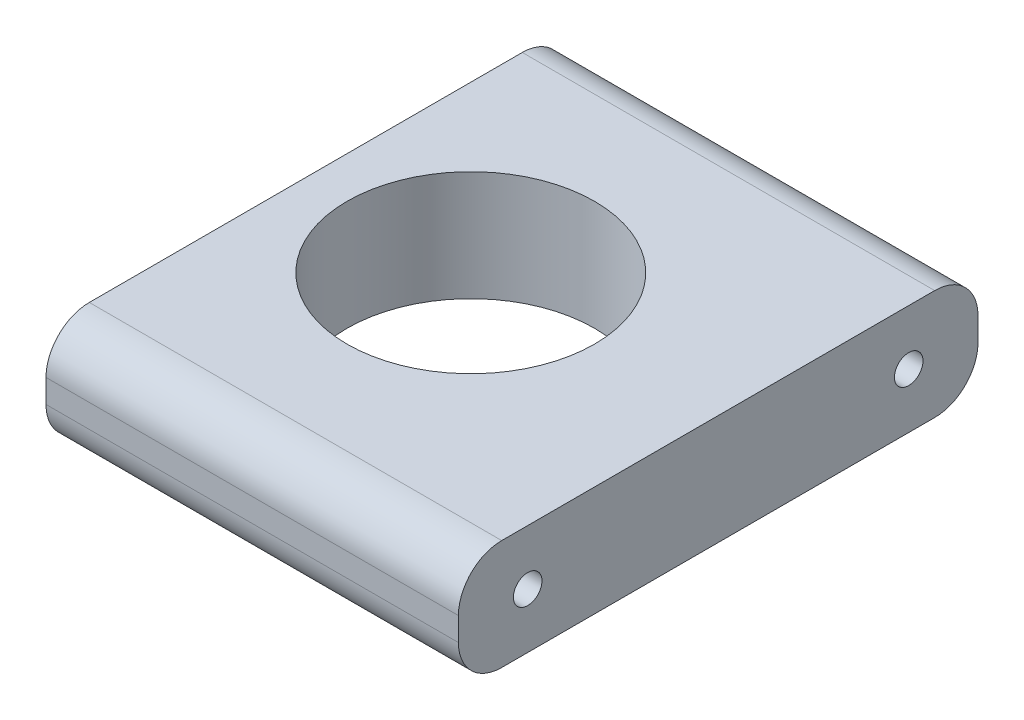
ISO-10303-21;
HEADER;
FILE_DESCRIPTION(('STEP AP214'),'2;1');
FILE_NAME('part.step','',(''),(''),'','','');
FILE_SCHEMA(('AUTOMOTIVE_DESIGN { 1 0 10303 214 1 1 1 1 }'));
ENDSEC;
DATA;
#1=APPLICATION_CONTEXT('core data for automotive mechanical design processes');
#2=APPLICATION_PROTOCOL_DEFINITION('international standard','automotive_design',2000,#1);
#3=PRODUCT_CONTEXT('',#1,'mechanical');
#4=PRODUCT('Part','Part','',(#3));
#5=PRODUCT_RELATED_PRODUCT_CATEGORY('part','',(#4));
#6=PRODUCT_DEFINITION_FORMATION('','',#4);
#7=PRODUCT_DEFINITION_CONTEXT('part definition',#1,'design');
#8=PRODUCT_DEFINITION('design','',#6,#7);
#9=PRODUCT_DEFINITION_SHAPE('','',#8);
#10=(LENGTH_UNIT() NAMED_UNIT(*) SI_UNIT(.MILLI.,.METRE.));
#11=(NAMED_UNIT(*) PLANE_ANGLE_UNIT() SI_UNIT($,.RADIAN.));
#12=(NAMED_UNIT(*) SI_UNIT($,.STERADIAN.) SOLID_ANGLE_UNIT());
#13=UNCERTAINTY_MEASURE_WITH_UNIT(LENGTH_MEASURE(1.E-05),#10,'distance_accuracy_value','');
#14=(GEOMETRIC_REPRESENTATION_CONTEXT(3) GLOBAL_UNCERTAINTY_ASSIGNED_CONTEXT((#13)) GLOBAL_UNIT_ASSIGNED_CONTEXT((#10,
#11,#12)) REPRESENTATION_CONTEXT('',''));
#15=CARTESIAN_POINT('',(0.,0.,0.));
#16=DIRECTION('',(0.,0.,1.));
#17=DIRECTION('',(1.,0.,0.));
#18=AXIS2_PLACEMENT_3D('',#15,#16,#17);
#19=CARTESIAN_POINT('',(-6.35250000000001,12.7,0.));
#20=DIRECTION('',(1.,0.,0.));
#21=DIRECTION('',(0.,0.,-1.));
#22=AXIS2_PLACEMENT_3D('',#19,#20,#21);
#23=PLANE('',#22);
#24=CARTESIAN_POINT('',(-6.3525,6.35,-19.8875));
#25=DIRECTION('',(1.,0.,0.));
#26=DIRECTION('',(0.,0.,-1.));
#27=AXIS2_PLACEMENT_3D('',#24,#25,#26);
#28=CIRCLE('',#27,1.64999999999999);
#29=CARTESIAN_POINT('',(-6.3525,6.35,-21.5375));
#30=VERTEX_POINT('',#29);
#31=EDGE_CURVE('E202',#30,#30,#28,.T.);
#32=ORIENTED_EDGE('',*,*,#31,.T.);
#33=EDGE_LOOP('',(#32));
#34=FACE_BOUND('',#33,.T.);
#35=CARTESIAN_POINT('',(-6.35250000000001,6.35,-63.8875));
#36=DIRECTION('',(1.,0.,0.));
#37=DIRECTION('',(0.,0.,-1.));
#38=AXIS2_PLACEMENT_3D('',#35,#36,#37);
#39=CIRCLE('',#38,1.64999999999999);
#40=CARTESIAN_POINT('',(-6.35250000000001,6.35,-65.5375));
#41=VERTEX_POINT('',#40);
#42=EDGE_CURVE('E189',#41,#41,#39,.T.);
#43=ORIENTED_EDGE('',*,*,#42,.T.);
#44=EDGE_LOOP('',(#43));
#45=FACE_BOUND('',#44,.T.);
#46=DIRECTION('',(0.,-1.,0.));
#47=VECTOR('',#46,1.);
#48=CARTESIAN_POINT('',(-6.3525,12.7,-11.8875));
#49=LINE('',#48,#47);
#50=CARTESIAN_POINT('',(-6.3525,7.7,-11.8875));
#51=VERTEX_POINT('',#50);
#52=CARTESIAN_POINT('',(-6.3525,5.,-11.8875));
#53=VERTEX_POINT('',#52);
#54=EDGE_CURVE('E134',#51,#53,#49,.T.);
#55=ORIENTED_EDGE('',*,*,#54,.F.);
#56=CARTESIAN_POINT('',(-6.35250000000001,7.7,-16.8875));
#57=DIRECTION('',(1.,0.,0.));
#58=DIRECTION('',(0.,0.,-1.));
#59=AXIS2_PLACEMENT_3D('',#56,#57,#58);
#60=CIRCLE('',#59,5.);
#61=CARTESIAN_POINT('',(-6.35250000000001,12.7,-16.8875));
#62=VERTEX_POINT('',#61);
#63=EDGE_CURVE('E138',#51,#62,#60,.F.);
#64=ORIENTED_EDGE('',*,*,#63,.T.);
#65=DIRECTION('',(0.,0.,1.));
#66=VECTOR('',#65,1.);
#67=CARTESIAN_POINT('',(-6.35250000000001,12.7,0.));
#68=LINE('',#67,#66);
#69=CARTESIAN_POINT('',(-6.3525,12.7,-66.8875));
#70=VERTEX_POINT('',#69);
#71=EDGE_CURVE('E188',#70,#62,#68,.T.);
#72=ORIENTED_EDGE('',*,*,#71,.F.);
#73=CARTESIAN_POINT('',(-6.3525,7.7,-66.8875));
#74=DIRECTION('',(1.,0.,0.));
#75=DIRECTION('',(0.,0.,-1.));
#76=AXIS2_PLACEMENT_3D('',#73,#74,#75);
#77=CIRCLE('',#76,5.);
#78=CARTESIAN_POINT('',(-6.3525,7.7,-71.8875));
#79=VERTEX_POINT('',#78);
#80=EDGE_CURVE('E139',#70,#79,#77,.F.);
#81=ORIENTED_EDGE('',*,*,#80,.T.);
#82=DIRECTION('',(0.,-1.,0.));
#83=VECTOR('',#82,1.);
#84=CARTESIAN_POINT('',(-6.3525,12.7,-71.8875));
#85=LINE('',#84,#83);
#86=CARTESIAN_POINT('',(-6.3525,5.,-71.8875));
#87=VERTEX_POINT('',#86);
#88=EDGE_CURVE('E166',#79,#87,#85,.T.);
#89=ORIENTED_EDGE('',*,*,#88,.T.);
#90=CARTESIAN_POINT('',(-6.3525,5.,-66.8875));
#91=DIRECTION('',(1.,0.,0.));
#92=DIRECTION('',(0.,0.,-1.));
#93=AXIS2_PLACEMENT_3D('',#90,#91,#92);
#94=CIRCLE('',#93,5.);
#95=CARTESIAN_POINT('',(-6.3525,0.,-66.8875));
#96=VERTEX_POINT('',#95);
#97=EDGE_CURVE('E141',#87,#96,#94,.F.);
#98=ORIENTED_EDGE('',*,*,#97,.T.);
#99=DIRECTION('',(0.,0.,1.));
#100=VECTOR('',#99,1.);
#101=CARTESIAN_POINT('',(-6.35250000000001,0.,0.));
#102=LINE('',#101,#100);
#103=CARTESIAN_POINT('',(-6.35250000000001,0.,-16.8875));
#104=VERTEX_POINT('',#103);
#105=EDGE_CURVE('E185',#96,#104,#102,.T.);
#106=ORIENTED_EDGE('',*,*,#105,.T.);
#107=CARTESIAN_POINT('',(-6.35250000000001,5.,-16.8875));
#108=DIRECTION('',(1.,0.,0.));
#109=DIRECTION('',(0.,0.,-1.));
#110=AXIS2_PLACEMENT_3D('',#107,#108,#109);
#111=CIRCLE('',#110,5.);
#112=EDGE_CURVE('E147',#104,#53,#111,.F.);
#113=ORIENTED_EDGE('',*,*,#112,.T.);
#114=EDGE_LOOP('',(#55,#64,#72,#81,#89,#98,#106,#113));
#115=FACE_BOUND('',#114,.T.);
#116=ADVANCED_FACE('F47',(#34,#45,#115),#23,.F.);
#117=CARTESIAN_POINT('',(0.,12.7,-11.8875));
#118=DIRECTION('',(0.,0.,1.));
#119=DIRECTION('',(1.,0.,0.));
#120=AXIS2_PLACEMENT_3D('',#117,#118,#119);
#121=PLANE('',#120);
#122=DIRECTION('',(0.,-1.,0.));
#123=VECTOR('',#122,1.);
#124=CARTESIAN_POINT('',(41.2725,12.7,-11.8875));
#125=LINE('',#124,#123);
#126=CARTESIAN_POINT('',(41.2725,7.7,-11.8875));
#127=VERTEX_POINT('',#126);
#128=CARTESIAN_POINT('',(41.2725,5.,-11.8875));
#129=VERTEX_POINT('',#128);
#130=EDGE_CURVE('E116',#127,#129,#125,.T.);
#131=ORIENTED_EDGE('',*,*,#130,.F.);
#132=DIRECTION('',(-1.,0.,0.));
#133=VECTOR('',#132,1.);
#134=CARTESIAN_POINT('',(0.,7.7,-11.8875));
#135=LINE('',#134,#133);
#136=EDGE_CURVE('E130',#127,#51,#135,.T.);
#137=ORIENTED_EDGE('',*,*,#136,.T.);
#138=ORIENTED_EDGE('',*,*,#54,.T.);
#139=DIRECTION('',(-1.,0.,0.));
#140=VECTOR('',#139,1.);
#141=CARTESIAN_POINT('',(41.2725,5.,-11.8875));
#142=LINE('',#141,#140);
#143=EDGE_CURVE('E133',#53,#129,#142,.F.);
#144=ORIENTED_EDGE('',*,*,#143,.T.);
#145=EDGE_LOOP('',(#131,#137,#138,#144));
#146=FACE_BOUND('',#145,.T.);
#147=ADVANCED_FACE('F128',(#146),#121,.T.);
#148=CARTESIAN_POINT('',(41.2725,12.7,0.));
#149=DIRECTION('',(1.,0.,0.));
#150=DIRECTION('',(0.,0.,-1.));
#151=AXIS2_PLACEMENT_3D('',#148,#149,#150);
#152=PLANE('',#151);
#153=CARTESIAN_POINT('',(41.2725,6.35,-19.8875));
#154=DIRECTION('',(1.,0.,0.));
#155=DIRECTION('',(0.,0.,-1.));
#156=AXIS2_PLACEMENT_3D('',#153,#154,#155);
#157=CIRCLE('',#156,1.64999999999999);
#158=CARTESIAN_POINT('',(41.2725,6.35,-21.5375));
#159=VERTEX_POINT('',#158);
#160=EDGE_CURVE('E205',#159,#159,#157,.T.);
#161=ORIENTED_EDGE('',*,*,#160,.F.);
#162=EDGE_LOOP('',(#161));
#163=FACE_BOUND('',#162,.T.);
#164=CARTESIAN_POINT('',(41.2725,6.35,-63.8875));
#165=DIRECTION('',(1.,0.,0.));
#166=DIRECTION('',(0.,0.,-1.));
#167=AXIS2_PLACEMENT_3D('',#164,#165,#166);
#168=CIRCLE('',#167,1.64999999999999);
#169=CARTESIAN_POINT('',(41.2725,6.35,-65.5375));
#170=VERTEX_POINT('',#169);
#171=EDGE_CURVE('E199',#170,#170,#168,.T.);
#172=ORIENTED_EDGE('',*,*,#171,.F.);
#173=EDGE_LOOP('',(#172));
#174=FACE_BOUND('',#173,.T.);
#175=DIRECTION('',(0.,0.,1.));
#176=VECTOR('',#175,1.);
#177=CARTESIAN_POINT('',(41.2725,12.7,0.));
#178=LINE('',#177,#176);
#179=CARTESIAN_POINT('',(41.2725,12.7,-66.8875));
#180=VERTEX_POINT('',#179);
#181=CARTESIAN_POINT('',(41.2725,12.7,-16.8875));
#182=VERTEX_POINT('',#181);
#183=EDGE_CURVE('E119',#180,#182,#178,.T.);
#184=ORIENTED_EDGE('',*,*,#183,.T.);
#185=CARTESIAN_POINT('',(41.2725,7.7,-16.8875));
#186=DIRECTION('',(1.,0.,0.));
#187=DIRECTION('',(0.,0.,-1.));
#188=AXIS2_PLACEMENT_3D('',#185,#186,#187);
#189=CIRCLE('',#188,5.);
#190=EDGE_CURVE('E113',#182,#127,#189,.T.);
#191=ORIENTED_EDGE('',*,*,#190,.T.);
#192=ORIENTED_EDGE('',*,*,#130,.T.);
#193=CARTESIAN_POINT('',(41.2725,5.,-16.8875));
#194=DIRECTION('',(1.,0.,0.));
#195=DIRECTION('',(0.,0.,-1.));
#196=AXIS2_PLACEMENT_3D('',#193,#194,#195);
#197=CIRCLE('',#196,5.);
#198=CARTESIAN_POINT('',(41.2725,0.,-16.8875));
#199=VERTEX_POINT('',#198);
#200=EDGE_CURVE('E124',#129,#199,#197,.T.);
#201=ORIENTED_EDGE('',*,*,#200,.T.);
#202=DIRECTION('',(0.,0.,1.));
#203=VECTOR('',#202,1.);
#204=CARTESIAN_POINT('',(41.2725,0.,0.));
#205=LINE('',#204,#203);
#206=CARTESIAN_POINT('',(41.2725,0.,-66.8875));
#207=VERTEX_POINT('',#206);
#208=EDGE_CURVE('E177',#207,#199,#205,.T.);
#209=ORIENTED_EDGE('',*,*,#208,.F.);
#210=CARTESIAN_POINT('',(41.2725,5.,-66.8875));
#211=DIRECTION('',(1.,0.,0.));
#212=DIRECTION('',(0.,0.,-1.));
#213=AXIS2_PLACEMENT_3D('',#210,#211,#212);
#214=CIRCLE('',#213,5.);
#215=CARTESIAN_POINT('',(41.2725,5.,-71.8875));
#216=VERTEX_POINT('',#215);
#217=EDGE_CURVE('E62',#207,#216,#214,.T.);
#218=ORIENTED_EDGE('',*,*,#217,.T.);
#219=DIRECTION('',(0.,-1.,0.));
#220=VECTOR('',#219,1.);
#221=CARTESIAN_POINT('',(41.2725,12.7,-71.8875));
#222=LINE('',#221,#220);
#223=CARTESIAN_POINT('',(41.2725,7.7,-71.8875));
#224=VERTEX_POINT('',#223);
#225=EDGE_CURVE('E135',#224,#216,#222,.T.);
#226=ORIENTED_EDGE('',*,*,#225,.F.);
#227=CARTESIAN_POINT('',(41.2725,7.7,-66.8875));
#228=DIRECTION('',(1.,0.,0.));
#229=DIRECTION('',(0.,0.,-1.));
#230=AXIS2_PLACEMENT_3D('',#227,#228,#229);
#231=CIRCLE('',#230,5.);
#232=EDGE_CURVE('E70',#224,#180,#231,.T.);
#233=ORIENTED_EDGE('',*,*,#232,.T.);
#234=EDGE_LOOP('',(#184,#191,#192,#201,#209,#218,#226,#233));
#235=FACE_BOUND('',#234,.T.);
#236=ADVANCED_FACE('F115',(#163,#174,#235),#152,.T.);
#237=CARTESIAN_POINT('',(0.,12.7,-71.8875));
#238=DIRECTION('',(0.,0.,-1.));
#239=DIRECTION('',(-1.,0.,0.));
#240=AXIS2_PLACEMENT_3D('',#237,#238,#239);
#241=PLANE('',#240);
#242=ORIENTED_EDGE('',*,*,#225,.T.);
#243=DIRECTION('',(1.,0.,0.));
#244=VECTOR('',#243,1.);
#245=CARTESIAN_POINT('',(-6.3525,5.,-71.8875));
#246=LINE('',#245,#244);
#247=EDGE_CURVE('E11',#216,#87,#246,.F.);
#248=ORIENTED_EDGE('',*,*,#247,.T.);
#249=ORIENTED_EDGE('',*,*,#88,.F.);
#250=DIRECTION('',(1.,0.,0.));
#251=VECTOR('',#250,1.);
#252=CARTESIAN_POINT('',(0.,7.7,-71.8875));
#253=LINE('',#252,#251);
#254=EDGE_CURVE('E55',#79,#224,#253,.T.);
#255=ORIENTED_EDGE('',*,*,#254,.T.);
#256=EDGE_LOOP('',(#242,#248,#249,#255));
#257=FACE_BOUND('',#256,.T.);
#258=ADVANCED_FACE('F163',(#257),#241,.T.);
#259=CARTESIAN_POINT('',(12.7,12.7,-41.8875));
#260=DIRECTION('',(0.,-1.,0.));
#261=DIRECTION('',(0.,0.,-1.));
#262=AXIS2_PLACEMENT_3D('',#259,#260,#261);
#263=CYLINDRICAL_SURFACE('',#262,14.2875);
#264=CARTESIAN_POINT('',(12.7,12.7,-41.8875));
#265=DIRECTION('',(0.,1.,0.));
#266=DIRECTION('',(0.,0.,1.));
#267=AXIS2_PLACEMENT_3D('',#264,#265,#266);
#268=CIRCLE('',#267,14.2875);
#269=CARTESIAN_POINT('',(12.7,12.7,-27.6));
#270=VERTEX_POINT('',#269);
#271=EDGE_CURVE('E169',#270,#270,#268,.T.);
#272=ORIENTED_EDGE('',*,*,#271,.T.);
#273=EDGE_LOOP('',(#272));
#274=FACE_BOUND('',#273,.T.);
#275=CARTESIAN_POINT('',(12.7,0.,-41.8875));
#276=DIRECTION('',(0.,1.,0.));
#277=DIRECTION('',(0.,0.,1.));
#278=AXIS2_PLACEMENT_3D('',#275,#276,#277);
#279=CIRCLE('',#278,14.2875);
#280=CARTESIAN_POINT('',(12.7,0.,-27.6));
#281=VERTEX_POINT('',#280);
#282=EDGE_CURVE('E184',#281,#281,#279,.T.);
#283=ORIENTED_EDGE('',*,*,#282,.F.);
#284=EDGE_LOOP('',(#283));
#285=FACE_BOUND('',#284,.T.);
#286=ADVANCED_FACE('F255',(#274,#285),#263,.F.);
#287=CARTESIAN_POINT('',(0.,12.7,0.));
#288=DIRECTION('',(0.,1.,0.));
#289=DIRECTION('',(0.,0.,1.));
#290=AXIS2_PLACEMENT_3D('',#287,#288,#289);
#291=PLANE('',#290);
#292=ORIENTED_EDGE('',*,*,#71,.T.);
#293=DIRECTION('',(-1.,0.,0.));
#294=VECTOR('',#293,1.);
#295=CARTESIAN_POINT('',(0.,12.7,-16.8875));
#296=LINE('',#295,#294);
#297=EDGE_CURVE('E152',#62,#182,#296,.F.);
#298=ORIENTED_EDGE('',*,*,#297,.T.);
#299=ORIENTED_EDGE('',*,*,#183,.F.);
#300=DIRECTION('',(1.,0.,0.));
#301=VECTOR('',#300,1.);
#302=CARTESIAN_POINT('',(0.,12.7,-66.8875));
#303=LINE('',#302,#301);
#304=EDGE_CURVE('E150',#180,#70,#303,.F.);
#305=ORIENTED_EDGE('',*,*,#304,.T.);
#306=EDGE_LOOP('',(#292,#298,#299,#305));
#307=FACE_BOUND('',#306,.T.);
#308=ORIENTED_EDGE('',*,*,#271,.F.);
#309=EDGE_LOOP('',(#308));
#310=FACE_BOUND('',#309,.T.);
#311=ADVANCED_FACE('F227',(#307,#310),#291,.T.);
#312=CARTESIAN_POINT('',(0.,0.,0.));
#313=DIRECTION('',(0.,1.,0.));
#314=DIRECTION('',(0.,0.,1.));
#315=AXIS2_PLACEMENT_3D('',#312,#313,#314);
#316=PLANE('',#315);
#317=ORIENTED_EDGE('',*,*,#208,.T.);
#318=DIRECTION('',(-1.,0.,0.));
#319=VECTOR('',#318,1.);
#320=CARTESIAN_POINT('',(-6.3525,0.,-16.8875));
#321=LINE('',#320,#319);
#322=EDGE_CURVE('E159',#199,#104,#321,.T.);
#323=ORIENTED_EDGE('',*,*,#322,.T.);
#324=ORIENTED_EDGE('',*,*,#105,.F.);
#325=DIRECTION('',(1.,0.,0.));
#326=VECTOR('',#325,1.);
#327=CARTESIAN_POINT('',(41.2725,0.,-66.8875));
#328=LINE('',#327,#326);
#329=EDGE_CURVE('E123',#96,#207,#328,.T.);
#330=ORIENTED_EDGE('',*,*,#329,.T.);
#331=EDGE_LOOP('',(#317,#323,#324,#330));
#332=FACE_BOUND('',#331,.T.);
#333=ORIENTED_EDGE('',*,*,#282,.T.);
#334=EDGE_LOOP('',(#333));
#335=FACE_BOUND('',#334,.T.);
#336=ADVANCED_FACE('F179',(#332,#335),#316,.F.);
#337=CARTESIAN_POINT('',(41.2725,6.35,-63.8875));
#338=DIRECTION('',(1.,0.,0.));
#339=DIRECTION('',(0.,0.,-1.));
#340=AXIS2_PLACEMENT_3D('',#337,#338,#339);
#341=CYLINDRICAL_SURFACE('',#340,1.64999999999999);
#342=ORIENTED_EDGE('',*,*,#42,.F.);
#343=EDGE_LOOP('',(#342));
#344=FACE_BOUND('',#343,.T.);
#345=ORIENTED_EDGE('',*,*,#171,.T.);
#346=EDGE_LOOP('',(#345));
#347=FACE_BOUND('',#346,.T.);
#348=ADVANCED_FACE('F216',(#344,#347),#341,.F.);
#349=CARTESIAN_POINT('',(41.2725,6.35,-19.8875));
#350=DIRECTION('',(1.,0.,0.));
#351=DIRECTION('',(0.,0.,-1.));
#352=AXIS2_PLACEMENT_3D('',#349,#350,#351);
#353=CYLINDRICAL_SURFACE('',#352,1.64999999999999);
#354=ORIENTED_EDGE('',*,*,#31,.F.);
#355=EDGE_LOOP('',(#354));
#356=FACE_BOUND('',#355,.T.);
#357=ORIENTED_EDGE('',*,*,#160,.T.);
#358=EDGE_LOOP('',(#357));
#359=FACE_BOUND('',#358,.T.);
#360=ADVANCED_FACE('F209',(#356,#359),#353,.F.);
#361=CARTESIAN_POINT('',(0.,7.7,-16.8875));
#362=DIRECTION('',(-1.,0.,0.));
#363=DIRECTION('',(0.,0.,1.));
#364=AXIS2_PLACEMENT_3D('',#361,#362,#363);
#365=CYLINDRICAL_SURFACE('',#364,5.);
#366=ORIENTED_EDGE('',*,*,#190,.F.);
#367=ORIENTED_EDGE('',*,*,#297,.F.);
#368=ORIENTED_EDGE('',*,*,#63,.F.);
#369=ORIENTED_EDGE('',*,*,#136,.F.);
#370=EDGE_LOOP('',(#366,#367,#368,#369));
#371=FACE_BOUND('',#370,.T.);
#372=ADVANCED_FACE('F137',(#371),#365,.T.);
#373=CARTESIAN_POINT('',(0.,5.,-16.8875));
#374=DIRECTION('',(1.,0.,0.));
#375=DIRECTION('',(0.,0.,-1.));
#376=AXIS2_PLACEMENT_3D('',#373,#374,#375);
#377=CYLINDRICAL_SURFACE('',#376,5.);
#378=ORIENTED_EDGE('',*,*,#200,.F.);
#379=ORIENTED_EDGE('',*,*,#143,.F.);
#380=ORIENTED_EDGE('',*,*,#112,.F.);
#381=ORIENTED_EDGE('',*,*,#322,.F.);
#382=EDGE_LOOP('',(#378,#379,#380,#381));
#383=FACE_BOUND('',#382,.T.);
#384=ADVANCED_FACE('F174',(#383),#377,.T.);
#385=CARTESIAN_POINT('',(0.,5.,-66.8875));
#386=DIRECTION('',(-1.,0.,0.));
#387=DIRECTION('',(0.,0.,1.));
#388=AXIS2_PLACEMENT_3D('',#385,#386,#387);
#389=CYLINDRICAL_SURFACE('',#388,5.);
#390=ORIENTED_EDGE('',*,*,#97,.F.);
#391=ORIENTED_EDGE('',*,*,#247,.F.);
#392=ORIENTED_EDGE('',*,*,#217,.F.);
#393=ORIENTED_EDGE('',*,*,#329,.F.);
#394=EDGE_LOOP('',(#390,#391,#392,#393));
#395=FACE_BOUND('',#394,.T.);
#396=ADVANCED_FACE('F244',(#395),#389,.T.);
#397=CARTESIAN_POINT('',(0.,7.7,-66.8875));
#398=DIRECTION('',(1.,0.,0.));
#399=DIRECTION('',(0.,0.,-1.));
#400=AXIS2_PLACEMENT_3D('',#397,#398,#399);
#401=CYLINDRICAL_SURFACE('',#400,5.);
#402=ORIENTED_EDGE('',*,*,#80,.F.);
#403=ORIENTED_EDGE('',*,*,#304,.F.);
#404=ORIENTED_EDGE('',*,*,#232,.F.);
#405=ORIENTED_EDGE('',*,*,#254,.F.);
#406=EDGE_LOOP('',(#402,#403,#404,#405));
#407=FACE_BOUND('',#406,.T.);
#408=ADVANCED_FACE('F49',(#407),#401,.T.);
#409=CLOSED_SHELL('',(#116,#147,#236,#258,#286,#311,#336,#348,#360,#372,#384,#396,#408));
#410=MANIFOLD_SOLID_BREP('B2',#409);
#411=ADVANCED_BREP_SHAPE_REPRESENTATION('',(#18,#410),#14);
#412=SHAPE_DEFINITION_REPRESENTATION(#9,#411);
ENDSEC;
END-ISO-10303-21;
